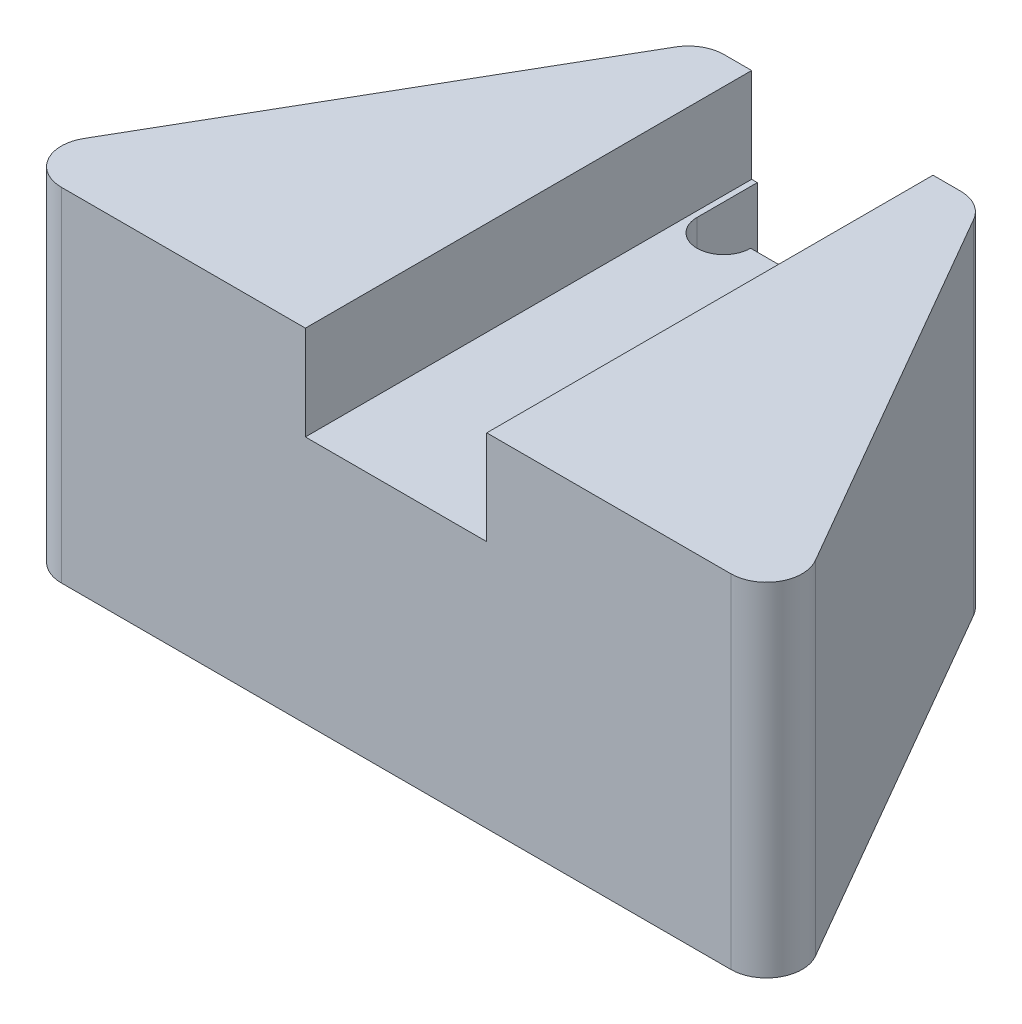
ISO-10303-21;
HEADER;
FILE_DESCRIPTION(('STEP AP214'),'2;1');
FILE_NAME('part.step','',(''),(''),'','','');
FILE_SCHEMA(('AUTOMOTIVE_DESIGN { 1 0 10303 214 1 1 1 1 }'));
ENDSEC;
DATA;
#1=APPLICATION_CONTEXT('core data for automotive mechanical design processes');
#2=APPLICATION_PROTOCOL_DEFINITION('international standard','automotive_design',2000,#1);
#3=PRODUCT_CONTEXT('',#1,'mechanical');
#4=PRODUCT('Part','Part','',(#3));
#5=PRODUCT_RELATED_PRODUCT_CATEGORY('part','',(#4));
#6=PRODUCT_DEFINITION_FORMATION('','',#4);
#7=PRODUCT_DEFINITION_CONTEXT('part definition',#1,'design');
#8=PRODUCT_DEFINITION('design','',#6,#7);
#9=PRODUCT_DEFINITION_SHAPE('','',#8);
#10=(LENGTH_UNIT() NAMED_UNIT(*) SI_UNIT(.MILLI.,.METRE.));
#11=(NAMED_UNIT(*) PLANE_ANGLE_UNIT() SI_UNIT($,.RADIAN.));
#12=(NAMED_UNIT(*) SI_UNIT($,.STERADIAN.) SOLID_ANGLE_UNIT());
#13=UNCERTAINTY_MEASURE_WITH_UNIT(LENGTH_MEASURE(1.E-05),#10,'distance_accuracy_value','');
#14=(GEOMETRIC_REPRESENTATION_CONTEXT(3) GLOBAL_UNCERTAINTY_ASSIGNED_CONTEXT((#13)) GLOBAL_UNIT_ASSIGNED_CONTEXT((#10,
#11,#12)) REPRESENTATION_CONTEXT('',''));
#15=CARTESIAN_POINT('',(0.,0.,0.));
#16=DIRECTION('',(0.,0.,1.));
#17=DIRECTION('',(1.,0.,0.));
#18=AXIS2_PLACEMENT_3D('',#15,#16,#17);
#19=CARTESIAN_POINT('',(0.,-9.6,0.));
#20=DIRECTION('',(0.,-1.,0.));
#21=DIRECTION('',(0.,0.,-1.));
#22=AXIS2_PLACEMENT_3D('',#19,#20,#21);
#23=PLANE('',#22);
#24=DIRECTION('',(-0.500000000000004,0.,-0.866025403784436));
#25=VECTOR('',#24,1.);
#26=CARTESIAN_POINT('',(7.7831216351296,-9.6,-12.5));
#27=LINE('',#26,#25);
#28=CARTESIAN_POINT('',(15.,-9.6,0.));
#29=VERTEX_POINT('',#28);
#30=CARTESIAN_POINT('',(8.36047190431923,-9.6,-11.5));
#31=VERTEX_POINT('',#30);
#32=EDGE_CURVE('E245',#29,#31,#27,.T.);
#33=ORIENTED_EDGE('',*,*,#32,.F.);
#34=DIRECTION('',(-1.,0.,0.));
#35=VECTOR('',#34,1.);
#36=CARTESIAN_POINT('',(0.,-9.6,0.));
#37=LINE('',#36,#35);
#38=CARTESIAN_POINT('',(-15.,-9.6,0.));
#39=VERTEX_POINT('',#38);
#40=EDGE_CURVE('E11',#29,#39,#37,.T.);
#41=ORIENTED_EDGE('',*,*,#40,.T.);
#42=DIRECTION('',(-0.500000000000004,0.,0.866025403784436));
#43=VECTOR('',#42,1.);
#44=CARTESIAN_POINT('',(-7.7831216351296,-9.6,-12.5));
#45=LINE('',#44,#43);
#46=CARTESIAN_POINT('',(-8.36047190431923,-9.6,-11.5));
#47=VERTEX_POINT('',#46);
#48=EDGE_CURVE('E253',#47,#39,#45,.T.);
#49=ORIENTED_EDGE('',*,*,#48,.F.);
#50=CARTESIAN_POINT('',(-6.62842109675035,-9.6,-10.5));
#51=DIRECTION('',(0.,-1.,0.));
#52=DIRECTION('',(0.,0.,-1.));
#53=AXIS2_PLACEMENT_3D('',#50,#51,#52);
#54=CIRCLE('',#53,2.);
#55=CARTESIAN_POINT('',(-6.62842109675035,-9.6,-12.5));
#56=VERTEX_POINT('',#55);
#57=EDGE_CURVE('E268',#47,#56,#54,.T.);
#58=ORIENTED_EDGE('',*,*,#57,.T.);
#59=DIRECTION('',(-1.,0.,0.));
#60=VECTOR('',#59,1.);
#61=CARTESIAN_POINT('',(-7.7831216351296,-9.6,-12.5));
#62=LINE('',#61,#60);
#63=CARTESIAN_POINT('',(6.62842109675036,-9.6,-12.5));
#64=VERTEX_POINT('',#63);
#65=EDGE_CURVE('E249',#64,#56,#62,.T.);
#66=ORIENTED_EDGE('',*,*,#65,.F.);
#67=CARTESIAN_POINT('',(6.62842109675036,-9.6,-10.5));
#68=DIRECTION('',(0.,-1.,0.));
#69=DIRECTION('',(0.,0.,-1.));
#70=AXIS2_PLACEMENT_3D('',#67,#68,#69);
#71=CIRCLE('',#70,2.);
#72=EDGE_CURVE('E265',#64,#31,#71,.T.);
#73=ORIENTED_EDGE('',*,*,#72,.T.);
#74=EDGE_LOOP('',(#33,#41,#49,#58,#66,#73));
#75=FACE_BOUND('',#74,.T.);
#76=ADVANCED_FACE('F37',(#75),#23,.T.);
#77=CARTESIAN_POINT('',(0.,9.6,0.));
#78=DIRECTION('',(0.,-1.,0.));
#79=DIRECTION('',(0.,0.,-1.));
#80=AXIS2_PLACEMENT_3D('',#77,#78,#79);
#81=PLANE('',#80);
#82=DIRECTION('',(1.,0.,0.));
#83=VECTOR('',#82,1.);
#84=CARTESIAN_POINT('',(-22.2168783648704,9.6,12.5));
#85=LINE('',#84,#83);
#86=CARTESIAN_POINT('',(-18.7527767497326,9.6,12.5));
#87=VERTEX_POINT('',#86);
#88=CARTESIAN_POINT('',(-5.08,9.6,12.5));
#89=VERTEX_POINT('',#88);
#90=EDGE_CURVE('E228',#87,#89,#85,.T.);
#91=ORIENTED_EDGE('',*,*,#90,.T.);
#92=DIRECTION('',(0.,0.,1.));
#93=VECTOR('',#92,1.);
#94=CARTESIAN_POINT('',(-5.08,9.6,-12.5));
#95=LINE('',#94,#93);
#96=CARTESIAN_POINT('',(-5.08,9.6,-12.5));
#97=VERTEX_POINT('',#96);
#98=EDGE_CURVE('E219',#97,#89,#95,.T.);
#99=ORIENTED_EDGE('',*,*,#98,.F.);
#100=DIRECTION('',(-1.,0.,0.));
#101=VECTOR('',#100,1.);
#102=CARTESIAN_POINT('',(-7.7831216351296,9.6,-12.5));
#103=LINE('',#102,#101);
#104=CARTESIAN_POINT('',(-6.62842109675035,9.6,-12.5));
#105=VERTEX_POINT('',#104);
#106=EDGE_CURVE('E235',#97,#105,#103,.T.);
#107=ORIENTED_EDGE('',*,*,#106,.T.);
#108=CARTESIAN_POINT('',(-6.62842109675035,9.6,-10.5));
#109=DIRECTION('',(0.,-1.,0.));
#110=DIRECTION('',(0.,0.,-1.));
#111=AXIS2_PLACEMENT_3D('',#108,#109,#110);
#112=CIRCLE('',#111,2.);
#113=CARTESIAN_POINT('',(-8.36047190431923,9.6,-11.5));
#114=VERTEX_POINT('',#113);
#115=EDGE_CURVE('E282',#105,#114,#112,.F.);
#116=ORIENTED_EDGE('',*,*,#115,.T.);
#117=DIRECTION('',(-0.500000000000004,0.,0.866025403784436));
#118=VECTOR('',#117,1.);
#119=CARTESIAN_POINT('',(-7.7831216351296,9.6,-12.5));
#120=LINE('',#119,#118);
#121=CARTESIAN_POINT('',(-20.4848275573015,9.6,9.49999999999999));
#122=VERTEX_POINT('',#121);
#123=EDGE_CURVE('E239',#114,#122,#120,.T.);
#124=ORIENTED_EDGE('',*,*,#123,.T.);
#125=CARTESIAN_POINT('',(-18.7527767497326,9.6,10.5));
#126=DIRECTION('',(0.,-1.,0.));
#127=DIRECTION('',(0.,0.,-1.));
#128=AXIS2_PLACEMENT_3D('',#125,#126,#127);
#129=CIRCLE('',#128,2.);
#130=EDGE_CURVE('E276',#122,#87,#129,.F.);
#131=ORIENTED_EDGE('',*,*,#130,.T.);
#132=EDGE_LOOP('',(#91,#99,#107,#116,#124,#131));
#133=FACE_BOUND('',#132,.T.);
#134=ADVANCED_FACE('F361',(#133),#81,.F.);
#135=CARTESIAN_POINT('',(22.2168783648704,9.6,12.5));
#136=DIRECTION('',(0.,0.,-1.));
#137=DIRECTION('',(-1.,0.,0.));
#138=AXIS2_PLACEMENT_3D('',#135,#136,#137);
#139=PLANE('',#138);
#140=DIRECTION('',(1.,0.,0.));
#141=VECTOR('',#140,1.);
#142=CARTESIAN_POINT('',(-5.08,4.32,12.5));
#143=LINE('',#142,#141);
#144=CARTESIAN_POINT('',(-5.08,4.32,12.5));
#145=VERTEX_POINT('',#144);
#146=CARTESIAN_POINT('',(5.08,4.32,12.5));
#147=VERTEX_POINT('',#146);
#148=EDGE_CURVE('E215',#145,#147,#143,.T.);
#149=ORIENTED_EDGE('',*,*,#148,.F.);
#150=DIRECTION('',(0.,-1.,0.));
#151=VECTOR('',#150,1.);
#152=CARTESIAN_POINT('',(-5.08,9.6,12.5));
#153=LINE('',#152,#151);
#154=EDGE_CURVE('E195',#89,#145,#153,.T.);
#155=ORIENTED_EDGE('',*,*,#154,.F.);
#156=ORIENTED_EDGE('',*,*,#90,.F.);
#157=DIRECTION('',(0.,-1.,0.));
#158=VECTOR('',#157,1.);
#159=CARTESIAN_POINT('',(-18.7527767497326,9.6,12.5));
#160=LINE('',#159,#158);
#161=CARTESIAN_POINT('',(-18.7527767497326,-9.6,12.5));
#162=VERTEX_POINT('',#161);
#163=EDGE_CURVE('E289',#87,#162,#160,.T.);
#164=ORIENTED_EDGE('',*,*,#163,.T.);
#165=DIRECTION('',(1.,0.,0.));
#166=VECTOR('',#165,1.);
#167=CARTESIAN_POINT('',(22.2168783648704,-9.6,12.5));
#168=LINE('',#167,#166);
#169=CARTESIAN_POINT('',(18.7527767497326,-9.6,12.5));
#170=VERTEX_POINT('',#169);
#171=EDGE_CURVE('E221',#162,#170,#168,.T.);
#172=ORIENTED_EDGE('',*,*,#171,.T.);
#173=DIRECTION('',(0.,-1.,0.));
#174=VECTOR('',#173,1.);
#175=CARTESIAN_POINT('',(18.7527767497326,9.6,12.5));
#176=LINE('',#175,#174);
#177=CARTESIAN_POINT('',(18.7527767497326,9.6,12.5));
#178=VERTEX_POINT('',#177);
#179=EDGE_CURVE('E292',#170,#178,#176,.F.);
#180=ORIENTED_EDGE('',*,*,#179,.T.);
#181=CARTESIAN_POINT('',(5.08,9.6,12.5));
#182=VERTEX_POINT('',#181);
#183=EDGE_CURVE('E232',#182,#178,#85,.T.);
#184=ORIENTED_EDGE('',*,*,#183,.F.);
#185=DIRECTION('',(0.,1.,0.));
#186=VECTOR('',#185,1.);
#187=CARTESIAN_POINT('',(5.08,9.6,12.5));
#188=LINE('',#187,#186);
#189=EDGE_CURVE('E206',#147,#182,#188,.T.);
#190=ORIENTED_EDGE('',*,*,#189,.F.);
#191=EDGE_LOOP('',(#149,#155,#156,#164,#172,#180,#184,#190));
#192=FACE_BOUND('',#191,.T.);
#193=ADVANCED_FACE('F340',(#192),#139,.F.);
#194=CARTESIAN_POINT('',(7.7831216351296,9.6,-12.5));
#195=DIRECTION('',(-0.866025403784436,0.,0.500000000000004));
#196=DIRECTION('',(0.500000000000004,0.,0.866025403784436));
#197=AXIS2_PLACEMENT_3D('',#194,#195,#196);
#198=PLANE('',#197);
#199=CARTESIAN_POINT('',(20.4848275573015,-9.6,9.49999999999999));
#200=VERTEX_POINT('',#199);
#201=EDGE_CURVE('E246',#200,#29,#27,.T.);
#202=ORIENTED_EDGE('',*,*,#201,.T.);
#203=ORIENTED_EDGE('',*,*,#32,.T.);
#204=DIRECTION('',(0.,-1.,0.));
#205=VECTOR('',#204,1.);
#206=CARTESIAN_POINT('',(8.36047190431923,9.6,-11.5));
#207=LINE('',#206,#205);
#208=CARTESIAN_POINT('',(8.36047190431923,9.6,-11.5));
#209=VERTEX_POINT('',#208);
#210=EDGE_CURVE('E287',#31,#209,#207,.F.);
#211=ORIENTED_EDGE('',*,*,#210,.T.);
#212=DIRECTION('',(-0.500000000000004,0.,-0.866025403784436));
#213=VECTOR('',#212,1.);
#214=CARTESIAN_POINT('',(7.7831216351296,9.6,-12.5));
#215=LINE('',#214,#213);
#216=CARTESIAN_POINT('',(20.4848275573015,9.6,9.49999999999999));
#217=VERTEX_POINT('',#216);
#218=EDGE_CURVE('E231',#217,#209,#215,.T.);
#219=ORIENTED_EDGE('',*,*,#218,.F.);
#220=DIRECTION('',(0.,-1.,0.));
#221=VECTOR('',#220,1.);
#222=CARTESIAN_POINT('',(20.4848275573015,9.6,9.5));
#223=LINE('',#222,#221);
#224=EDGE_CURVE('E284',#217,#200,#223,.T.);
#225=ORIENTED_EDGE('',*,*,#224,.T.);
#226=EDGE_LOOP('',(#202,#203,#211,#219,#225));
#227=FACE_BOUND('',#226,.T.);
#228=ADVANCED_FACE('F377',(#227),#198,.F.);
#229=CARTESIAN_POINT('',(-7.7831216351296,9.6,-12.5));
#230=DIRECTION('',(0.,0.,1.));
#231=DIRECTION('',(1.,0.,0.));
#232=AXIS2_PLACEMENT_3D('',#229,#230,#231);
#233=PLANE('',#232);
#234=DIRECTION('',(-1.,0.,0.));
#235=VECTOR('',#234,1.);
#236=CARTESIAN_POINT('',(4.7625,-5.20499999999998,-12.5));
#237=LINE('',#236,#235);
#238=CARTESIAN_POINT('',(4.7625,-5.20499999999998,-12.5));
#239=VERTEX_POINT('',#238);
#240=CARTESIAN_POINT('',(-4.7625,-5.205,-12.5));
#241=VERTEX_POINT('',#240);
#242=EDGE_CURVE('E315',#239,#241,#237,.T.);
#243=ORIENTED_EDGE('',*,*,#242,.F.);
#244=DIRECTION('',(0.,-1.,0.));
#245=VECTOR('',#244,1.);
#246=CARTESIAN_POINT('',(4.7625,4.32,-12.5));
#247=LINE('',#246,#245);
#248=CARTESIAN_POINT('',(4.7625,4.32,-12.5));
#249=VERTEX_POINT('',#248);
#250=EDGE_CURVE('E312',#249,#239,#247,.T.);
#251=ORIENTED_EDGE('',*,*,#250,.F.);
#252=DIRECTION('',(1.,0.,0.));
#253=VECTOR('',#252,1.);
#254=CARTESIAN_POINT('',(-5.08,4.32,-12.5));
#255=LINE('',#254,#253);
#256=CARTESIAN_POINT('',(5.08,4.32,-12.5));
#257=VERTEX_POINT('',#256);
#258=EDGE_CURVE('E205',#249,#257,#255,.T.);
#259=ORIENTED_EDGE('',*,*,#258,.T.);
#260=DIRECTION('',(0.,1.,0.));
#261=VECTOR('',#260,1.);
#262=CARTESIAN_POINT('',(5.08,9.6,-12.5));
#263=LINE('',#262,#261);
#264=CARTESIAN_POINT('',(5.08,9.6,-12.5));
#265=VERTEX_POINT('',#264);
#266=EDGE_CURVE('E209',#257,#265,#263,.T.);
#267=ORIENTED_EDGE('',*,*,#266,.T.);
#268=CARTESIAN_POINT('',(6.62842109675036,9.6,-12.5));
#269=VERTEX_POINT('',#268);
#270=EDGE_CURVE('E236',#269,#265,#103,.T.);
#271=ORIENTED_EDGE('',*,*,#270,.F.);
#272=DIRECTION('',(0.,-1.,0.));
#273=VECTOR('',#272,1.);
#274=CARTESIAN_POINT('',(6.62842109675036,9.6,-12.5));
#275=LINE('',#274,#273);
#276=EDGE_CURVE('E270',#269,#64,#275,.T.);
#277=ORIENTED_EDGE('',*,*,#276,.T.);
#278=ORIENTED_EDGE('',*,*,#65,.T.);
#279=DIRECTION('',(0.,-1.,0.));
#280=VECTOR('',#279,1.);
#281=CARTESIAN_POINT('',(-6.62842109675035,9.6,-12.5));
#282=LINE('',#281,#280);
#283=EDGE_CURVE('E273',#56,#105,#282,.F.);
#284=ORIENTED_EDGE('',*,*,#283,.T.);
#285=ORIENTED_EDGE('',*,*,#106,.F.);
#286=DIRECTION('',(0.,-1.,0.));
#287=VECTOR('',#286,1.);
#288=CARTESIAN_POINT('',(-5.08,9.6,-12.5));
#289=LINE('',#288,#287);
#290=CARTESIAN_POINT('',(-5.08,4.32,-12.5));
#291=VERTEX_POINT('',#290);
#292=EDGE_CURVE('E202',#97,#291,#289,.T.);
#293=ORIENTED_EDGE('',*,*,#292,.T.);
#294=CARTESIAN_POINT('',(-4.7625,4.32,-12.5));
#295=VERTEX_POINT('',#294);
#296=EDGE_CURVE('E207',#291,#295,#255,.T.);
#297=ORIENTED_EDGE('',*,*,#296,.T.);
#298=DIRECTION('',(0.,1.,0.));
#299=VECTOR('',#298,1.);
#300=CARTESIAN_POINT('',(-4.7625,4.32,-12.5));
#301=LINE('',#300,#299);
#302=EDGE_CURVE('E191',#241,#295,#301,.T.);
#303=ORIENTED_EDGE('',*,*,#302,.F.);
#304=EDGE_LOOP('',(#243,#251,#259,#267,#271,#277,#278,#284,#285,#293,#297,#303));
#305=FACE_BOUND('',#304,.T.);
#306=ADVANCED_FACE('F329',(#305),#233,.F.);
#307=CARTESIAN_POINT('',(-7.7831216351296,9.6,-12.5));
#308=DIRECTION('',(0.866025403784436,0.,0.500000000000004));
#309=DIRECTION('',(0.500000000000004,0.,-0.866025403784436));
#310=AXIS2_PLACEMENT_3D('',#307,#308,#309);
#311=PLANE('',#310);
#312=ORIENTED_EDGE('',*,*,#123,.F.);
#313=DIRECTION('',(0.,-1.,0.));
#314=VECTOR('',#313,1.);
#315=CARTESIAN_POINT('',(-8.36047190431923,9.6,-11.5));
#316=LINE('',#315,#314);
#317=EDGE_CURVE('E257',#114,#47,#316,.T.);
#318=ORIENTED_EDGE('',*,*,#317,.T.);
#319=ORIENTED_EDGE('',*,*,#48,.T.);
#320=CARTESIAN_POINT('',(-20.4848275573015,-9.6,9.49999999999999));
#321=VERTEX_POINT('',#320);
#322=EDGE_CURVE('E252',#39,#321,#45,.T.);
#323=ORIENTED_EDGE('',*,*,#322,.T.);
#324=DIRECTION('',(0.,-1.,0.));
#325=VECTOR('',#324,1.);
#326=CARTESIAN_POINT('',(-20.4848275573015,9.6,9.49999999999999));
#327=LINE('',#326,#325);
#328=EDGE_CURVE('E242',#321,#122,#327,.F.);
#329=ORIENTED_EDGE('',*,*,#328,.T.);
#330=EDGE_LOOP('',(#312,#318,#319,#323,#329));
#331=FACE_BOUND('',#330,.T.);
#332=ADVANCED_FACE('F364',(#331),#311,.F.);
#333=ORIENTED_EDGE('',*,*,#270,.T.);
#334=DIRECTION('',(0.,0.,1.));
#335=VECTOR('',#334,1.);
#336=CARTESIAN_POINT('',(5.08,9.6,-12.5));
#337=LINE('',#336,#335);
#338=EDGE_CURVE('E222',#265,#182,#337,.T.);
#339=ORIENTED_EDGE('',*,*,#338,.T.);
#340=ORIENTED_EDGE('',*,*,#183,.T.);
#341=CARTESIAN_POINT('',(18.7527767497326,9.6,10.5));
#342=DIRECTION('',(0.,-1.,0.));
#343=DIRECTION('',(0.,0.,-1.));
#344=AXIS2_PLACEMENT_3D('',#341,#342,#343);
#345=CIRCLE('',#344,2.);
#346=EDGE_CURVE('E278',#178,#217,#345,.F.);
#347=ORIENTED_EDGE('',*,*,#346,.T.);
#348=ORIENTED_EDGE('',*,*,#218,.T.);
#349=CARTESIAN_POINT('',(6.62842109675036,9.6,-10.5));
#350=DIRECTION('',(0.,-1.,0.));
#351=DIRECTION('',(0.,0.,-1.));
#352=AXIS2_PLACEMENT_3D('',#349,#350,#351);
#353=CIRCLE('',#352,2.);
#354=EDGE_CURVE('E280',#209,#269,#353,.F.);
#355=ORIENTED_EDGE('',*,*,#354,.T.);
#356=EDGE_LOOP('',(#333,#339,#340,#347,#348,#355));
#357=FACE_BOUND('',#356,.T.);
#358=ADVANCED_FACE('F346',(#357),#81,.F.);
#359=ORIENTED_EDGE('',*,*,#40,.F.);
#360=ORIENTED_EDGE('',*,*,#201,.F.);
#361=CARTESIAN_POINT('',(18.7527767497326,-9.6,10.5));
#362=DIRECTION('',(0.,-1.,0.));
#363=DIRECTION('',(0.,0.,-1.));
#364=AXIS2_PLACEMENT_3D('',#361,#362,#363);
#365=CIRCLE('',#364,2.);
#366=EDGE_CURVE('E263',#200,#170,#365,.T.);
#367=ORIENTED_EDGE('',*,*,#366,.T.);
#368=ORIENTED_EDGE('',*,*,#171,.F.);
#369=CARTESIAN_POINT('',(-18.7527767497326,-9.6,10.5));
#370=DIRECTION('',(0.,-1.,0.));
#371=DIRECTION('',(0.,0.,-1.));
#372=AXIS2_PLACEMENT_3D('',#369,#370,#371);
#373=CIRCLE('',#372,2.);
#374=EDGE_CURVE('E260',#162,#321,#373,.T.);
#375=ORIENTED_EDGE('',*,*,#374,.T.);
#376=ORIENTED_EDGE('',*,*,#322,.F.);
#377=EDGE_LOOP('',(#359,#360,#367,#368,#375,#376));
#378=FACE_BOUND('',#377,.T.);
#379=ADVANCED_FACE('F370',(#378),#23,.T.);
#380=CARTESIAN_POINT('',(-6.62842109675035,9.6,-10.5));
#381=DIRECTION('',(0.,-1.,0.));
#382=DIRECTION('',(0.,0.,-1.));
#383=AXIS2_PLACEMENT_3D('',#380,#381,#382);
#384=CYLINDRICAL_SURFACE('',#383,2.);
#385=ORIENTED_EDGE('',*,*,#115,.F.);
#386=ORIENTED_EDGE('',*,*,#283,.F.);
#387=ORIENTED_EDGE('',*,*,#57,.F.);
#388=ORIENTED_EDGE('',*,*,#317,.F.);
#389=EDGE_LOOP('',(#385,#386,#387,#388));
#390=FACE_BOUND('',#389,.T.);
#391=ADVANCED_FACE('F357',(#390),#384,.T.);
#392=CARTESIAN_POINT('',(6.62842109675036,9.6,-10.5));
#393=DIRECTION('',(0.,-1.,0.));
#394=DIRECTION('',(0.,0.,-1.));
#395=AXIS2_PLACEMENT_3D('',#392,#393,#394);
#396=CYLINDRICAL_SURFACE('',#395,2.);
#397=ORIENTED_EDGE('',*,*,#354,.F.);
#398=ORIENTED_EDGE('',*,*,#210,.F.);
#399=ORIENTED_EDGE('',*,*,#72,.F.);
#400=ORIENTED_EDGE('',*,*,#276,.F.);
#401=EDGE_LOOP('',(#397,#398,#399,#400));
#402=FACE_BOUND('',#401,.T.);
#403=ADVANCED_FACE('F352',(#402),#396,.T.);
#404=CARTESIAN_POINT('',(18.7527767497326,9.6,10.5));
#405=DIRECTION('',(0.,-1.,0.));
#406=DIRECTION('',(0.,0.,-1.));
#407=AXIS2_PLACEMENT_3D('',#404,#405,#406);
#408=CYLINDRICAL_SURFACE('',#407,2.);
#409=ORIENTED_EDGE('',*,*,#346,.F.);
#410=ORIENTED_EDGE('',*,*,#179,.F.);
#411=ORIENTED_EDGE('',*,*,#366,.F.);
#412=ORIENTED_EDGE('',*,*,#224,.F.);
#413=EDGE_LOOP('',(#409,#410,#411,#412));
#414=FACE_BOUND('',#413,.T.);
#415=ADVANCED_FACE('F374',(#414),#408,.T.);
#416=CARTESIAN_POINT('',(-18.7527767497326,9.6,10.5));
#417=DIRECTION('',(0.,-1.,0.));
#418=DIRECTION('',(0.,0.,-1.));
#419=AXIS2_PLACEMENT_3D('',#416,#417,#418);
#420=CYLINDRICAL_SURFACE('',#419,2.);
#421=ORIENTED_EDGE('',*,*,#130,.F.);
#422=ORIENTED_EDGE('',*,*,#328,.F.);
#423=ORIENTED_EDGE('',*,*,#374,.F.);
#424=ORIENTED_EDGE('',*,*,#163,.F.);
#425=EDGE_LOOP('',(#421,#422,#423,#424));
#426=FACE_BOUND('',#425,.T.);
#427=ADVANCED_FACE('F39',(#426),#420,.T.);
#428=CARTESIAN_POINT('',(-5.08,9.6,-12.5));
#429=DIRECTION('',(-1.,0.,0.));
#430=DIRECTION('',(0.,0.,1.));
#431=AXIS2_PLACEMENT_3D('',#428,#429,#430);
#432=PLANE('',#431);
#433=ORIENTED_EDGE('',*,*,#154,.T.);
#434=DIRECTION('',(0.,0.,1.));
#435=VECTOR('',#434,1.);
#436=CARTESIAN_POINT('',(-5.08,4.32,-12.5));
#437=LINE('',#436,#435);
#438=EDGE_CURVE('E212',#291,#145,#437,.T.);
#439=ORIENTED_EDGE('',*,*,#438,.F.);
#440=ORIENTED_EDGE('',*,*,#292,.F.);
#441=ORIENTED_EDGE('',*,*,#98,.T.);
#442=EDGE_LOOP('',(#433,#439,#440,#441));
#443=FACE_BOUND('',#442,.T.);
#444=ADVANCED_FACE('F336',(#443),#432,.F.);
#445=CARTESIAN_POINT('',(5.08,9.6,-12.5));
#446=DIRECTION('',(1.,0.,0.));
#447=DIRECTION('',(0.,1.,0.));
#448=AXIS2_PLACEMENT_3D('',#445,#446,#447);
#449=PLANE('',#448);
#450=ORIENTED_EDGE('',*,*,#189,.T.);
#451=ORIENTED_EDGE('',*,*,#338,.F.);
#452=ORIENTED_EDGE('',*,*,#266,.F.);
#453=DIRECTION('',(0.,0.,1.));
#454=VECTOR('',#453,1.);
#455=CARTESIAN_POINT('',(5.08,4.32,-12.5));
#456=LINE('',#455,#454);
#457=EDGE_CURVE('E225',#257,#147,#456,.T.);
#458=ORIENTED_EDGE('',*,*,#457,.T.);
#459=EDGE_LOOP('',(#450,#451,#452,#458));
#460=FACE_BOUND('',#459,.T.);
#461=ADVANCED_FACE('F343',(#460),#449,.F.);
#462=CARTESIAN_POINT('',(-5.08,4.32,-12.5));
#463=DIRECTION('',(0.,-1.,0.));
#464=DIRECTION('',(1.,0.,0.));
#465=AXIS2_PLACEMENT_3D('',#462,#463,#464);
#466=PLANE('',#465);
#467=DIRECTION('',(0.,0.,-1.));
#468=VECTOR('',#467,1.);
#469=CARTESIAN_POINT('',(4.7625,4.32,-9.125));
#470=LINE('',#469,#468);
#471=CARTESIAN_POINT('',(4.7625,4.32,-9.125));
#472=VERTEX_POINT('',#471);
#473=EDGE_CURVE('E192',#472,#249,#470,.T.);
#474=ORIENTED_EDGE('',*,*,#473,.F.);
#475=CARTESIAN_POINT('',(3.2625,4.32,-9.125));
#476=DIRECTION('',(0.,1.,0.));
#477=DIRECTION('',(-1.,0.,0.));
#478=AXIS2_PLACEMENT_3D('',#475,#476,#477);
#479=CIRCLE('',#478,1.5);
#480=CARTESIAN_POINT('',(1.7625,4.32,-9.125));
#481=VERTEX_POINT('',#480);
#482=EDGE_CURVE('E299',#481,#472,#479,.T.);
#483=ORIENTED_EDGE('',*,*,#482,.F.);
#484=DIRECTION('',(1.,0.,0.));
#485=VECTOR('',#484,1.);
#486=CARTESIAN_POINT('',(4.7625,4.32,-9.125));
#487=LINE('',#486,#485);
#488=CARTESIAN_POINT('',(-1.7625,4.32,-9.125));
#489=VERTEX_POINT('',#488);
#490=EDGE_CURVE('E175',#489,#481,#487,.T.);
#491=ORIENTED_EDGE('',*,*,#490,.F.);
#492=CARTESIAN_POINT('',(-3.2625,4.32,-9.125));
#493=DIRECTION('',(0.,1.,0.));
#494=DIRECTION('',(-1.,0.,0.));
#495=AXIS2_PLACEMENT_3D('',#492,#493,#494);
#496=CIRCLE('',#495,1.5);
#497=CARTESIAN_POINT('',(-4.7625,4.32,-9.125));
#498=VERTEX_POINT('',#497);
#499=EDGE_CURVE('E168',#498,#489,#496,.T.);
#500=ORIENTED_EDGE('',*,*,#499,.F.);
#501=DIRECTION('',(0.,0.,-1.));
#502=VECTOR('',#501,1.);
#503=CARTESIAN_POINT('',(-4.7625,4.32,-9.125));
#504=LINE('',#503,#502);
#505=EDGE_CURVE('E184',#498,#295,#504,.T.);
#506=ORIENTED_EDGE('',*,*,#505,.T.);
#507=ORIENTED_EDGE('',*,*,#296,.F.);
#508=ORIENTED_EDGE('',*,*,#438,.T.);
#509=ORIENTED_EDGE('',*,*,#148,.T.);
#510=ORIENTED_EDGE('',*,*,#457,.F.);
#511=ORIENTED_EDGE('',*,*,#258,.F.);
#512=EDGE_LOOP('',(#474,#483,#491,#500,#506,#507,#508,#509,#510,#511));
#513=FACE_BOUND('',#512,.T.);
#514=ADVANCED_FACE('F182',(#513),#466,.F.);
#515=CARTESIAN_POINT('',(4.7625,4.32,-9.125));
#516=DIRECTION('',(1.,0.,0.));
#517=DIRECTION('',(0.,0.,-1.));
#518=AXIS2_PLACEMENT_3D('',#515,#516,#517);
#519=PLANE('',#518);
#520=ORIENTED_EDGE('',*,*,#250,.T.);
#521=DIRECTION('',(0.,0.,-1.));
#522=VECTOR('',#521,1.);
#523=CARTESIAN_POINT('',(4.7625,-5.20499999999998,-9.125));
#524=LINE('',#523,#522);
#525=CARTESIAN_POINT('',(4.7625,-5.20499999999998,-9.125));
#526=VERTEX_POINT('',#525);
#527=EDGE_CURVE('E197',#526,#239,#524,.T.);
#528=ORIENTED_EDGE('',*,*,#527,.F.);
#529=DIRECTION('',(0.,-1.,0.));
#530=VECTOR('',#529,1.);
#531=CARTESIAN_POINT('',(4.7625,4.32,-9.125));
#532=LINE('',#531,#530);
#533=EDGE_CURVE('E317',#472,#526,#532,.T.);
#534=ORIENTED_EDGE('',*,*,#533,.F.);
#535=ORIENTED_EDGE('',*,*,#473,.T.);
#536=EDGE_LOOP('',(#520,#528,#534,#535));
#537=FACE_BOUND('',#536,.T.);
#538=ADVANCED_FACE('F325',(#537),#519,.F.);
#539=CARTESIAN_POINT('',(-4.7625,4.32,-9.125));
#540=DIRECTION('',(-1.,0.,0.));
#541=DIRECTION('',(0.,-1.,0.));
#542=AXIS2_PLACEMENT_3D('',#539,#540,#541);
#543=PLANE('',#542);
#544=ORIENTED_EDGE('',*,*,#302,.T.);
#545=ORIENTED_EDGE('',*,*,#505,.F.);
#546=DIRECTION('',(0.,1.,0.));
#547=VECTOR('',#546,1.);
#548=CARTESIAN_POINT('',(-4.7625,4.32,-9.125));
#549=LINE('',#548,#547);
#550=CARTESIAN_POINT('',(-4.7625,-5.205,-9.125));
#551=VERTEX_POINT('',#550);
#552=EDGE_CURVE('E165',#551,#498,#549,.T.);
#553=ORIENTED_EDGE('',*,*,#552,.F.);
#554=DIRECTION('',(0.,0.,-1.));
#555=VECTOR('',#554,1.);
#556=CARTESIAN_POINT('',(-4.7625,-5.205,-9.125));
#557=LINE('',#556,#555);
#558=EDGE_CURVE('E193',#551,#241,#557,.T.);
#559=ORIENTED_EDGE('',*,*,#558,.T.);
#560=EDGE_LOOP('',(#544,#545,#553,#559));
#561=FACE_BOUND('',#560,.T.);
#562=ADVANCED_FACE('F189',(#561),#543,.F.);
#563=CARTESIAN_POINT('',(4.7625,-5.20499999999998,-9.125));
#564=DIRECTION('',(0.,-1.,0.));
#565=DIRECTION('',(1.,0.,0.));
#566=AXIS2_PLACEMENT_3D('',#563,#564,#565);
#567=PLANE('',#566);
#568=DIRECTION('',(-1.,0.,0.));
#569=VECTOR('',#568,1.);
#570=CARTESIAN_POINT('',(4.7625,-5.20499999999998,-9.125));
#571=LINE('',#570,#569);
#572=CARTESIAN_POINT('',(1.7625,-5.20499999999999,-9.125));
#573=VERTEX_POINT('',#572);
#574=CARTESIAN_POINT('',(-1.7625,-5.20499999999999,-9.125));
#575=VERTEX_POINT('',#574);
#576=EDGE_CURVE('E176',#573,#575,#571,.T.);
#577=ORIENTED_EDGE('',*,*,#576,.F.);
#578=CARTESIAN_POINT('',(3.2625,-5.20499999999999,-9.125));
#579=DIRECTION('',(0.,-1.,0.));
#580=DIRECTION('',(1.,0.,0.));
#581=AXIS2_PLACEMENT_3D('',#578,#579,#580);
#582=CIRCLE('',#581,1.5);
#583=EDGE_CURVE('E302',#573,#526,#582,.F.);
#584=ORIENTED_EDGE('',*,*,#583,.T.);
#585=ORIENTED_EDGE('',*,*,#527,.T.);
#586=ORIENTED_EDGE('',*,*,#242,.T.);
#587=ORIENTED_EDGE('',*,*,#558,.F.);
#588=CARTESIAN_POINT('',(-3.2625,-5.205,-9.125));
#589=DIRECTION('',(0.,-1.,0.));
#590=DIRECTION('',(1.,0.,0.));
#591=AXIS2_PLACEMENT_3D('',#588,#589,#590);
#592=CIRCLE('',#591,1.5);
#593=EDGE_CURVE('E171',#551,#575,#592,.F.);
#594=ORIENTED_EDGE('',*,*,#593,.T.);
#595=EDGE_LOOP('',(#577,#584,#585,#586,#587,#594));
#596=FACE_BOUND('',#595,.T.);
#597=ADVANCED_FACE('F323',(#596),#567,.F.);
#598=CARTESIAN_POINT('',(0.,0.,-9.125));
#599=DIRECTION('',(0.,0.,-1.));
#600=DIRECTION('',(-1.,0.,0.));
#601=AXIS2_PLACEMENT_3D('',#598,#599,#600);
#602=PLANE('',#601);
#603=DIRECTION('',(0.,1.,0.));
#604=VECTOR('',#603,1.);
#605=CARTESIAN_POINT('',(1.7625,-9.44764068711928,-9.125));
#606=LINE('',#605,#604);
#607=EDGE_CURVE('E46',#573,#481,#606,.T.);
#608=ORIENTED_EDGE('',*,*,#607,.F.);
#609=ORIENTED_EDGE('',*,*,#576,.T.);
#610=DIRECTION('',(0.,1.,0.));
#611=VECTOR('',#610,1.);
#612=CARTESIAN_POINT('',(-1.7625,-9.44764068711928,-9.125));
#613=LINE('',#612,#611);
#614=EDGE_CURVE('E295',#489,#575,#613,.F.);
#615=ORIENTED_EDGE('',*,*,#614,.F.);
#616=ORIENTED_EDGE('',*,*,#490,.T.);
#617=EDGE_LOOP('',(#608,#609,#615,#616));
#618=FACE_BOUND('',#617,.T.);
#619=ADVANCED_FACE('F308',(#618),#602,.T.);
#620=CARTESIAN_POINT('',(-3.2625,-9.44764068711928,-9.125));
#621=DIRECTION('',(0.,1.,0.));
#622=DIRECTION('',(-1.,0.,0.));
#623=AXIS2_PLACEMENT_3D('',#620,#621,#622);
#624=CYLINDRICAL_SURFACE('',#623,1.5);
#625=ORIENTED_EDGE('',*,*,#552,.T.);
#626=ORIENTED_EDGE('',*,*,#499,.T.);
#627=ORIENTED_EDGE('',*,*,#614,.T.);
#628=ORIENTED_EDGE('',*,*,#593,.F.);
#629=EDGE_LOOP('',(#625,#626,#627,#628));
#630=FACE_BOUND('',#629,.T.);
#631=ADVANCED_FACE('F167',(#630),#624,.F.);
#632=CARTESIAN_POINT('',(3.2625,-9.44764068711928,-9.125));
#633=DIRECTION('',(0.,1.,0.));
#634=DIRECTION('',(-1.,0.,0.));
#635=AXIS2_PLACEMENT_3D('',#632,#633,#634);
#636=CYLINDRICAL_SURFACE('',#635,1.5);
#637=ORIENTED_EDGE('',*,*,#607,.T.);
#638=ORIENTED_EDGE('',*,*,#482,.T.);
#639=ORIENTED_EDGE('',*,*,#533,.T.);
#640=ORIENTED_EDGE('',*,*,#583,.F.);
#641=EDGE_LOOP('',(#637,#638,#639,#640));
#642=FACE_BOUND('',#641,.T.);
#643=ADVANCED_FACE('F298',(#642),#636,.F.);
#644=CLOSED_SHELL('',(#76,#134,#193,#228,#306,#332,#358,#379,#391,#403,#415,#427,#444,#461,#514,
#538,#562,#597,#619,#631,#643));
#645=MANIFOLD_SOLID_BREP('B2',#644);
#646=ADVANCED_BREP_SHAPE_REPRESENTATION('',(#18,#645),#14);
#647=SHAPE_DEFINITION_REPRESENTATION(#9,#646);
ENDSEC;
END-ISO-10303-21;
